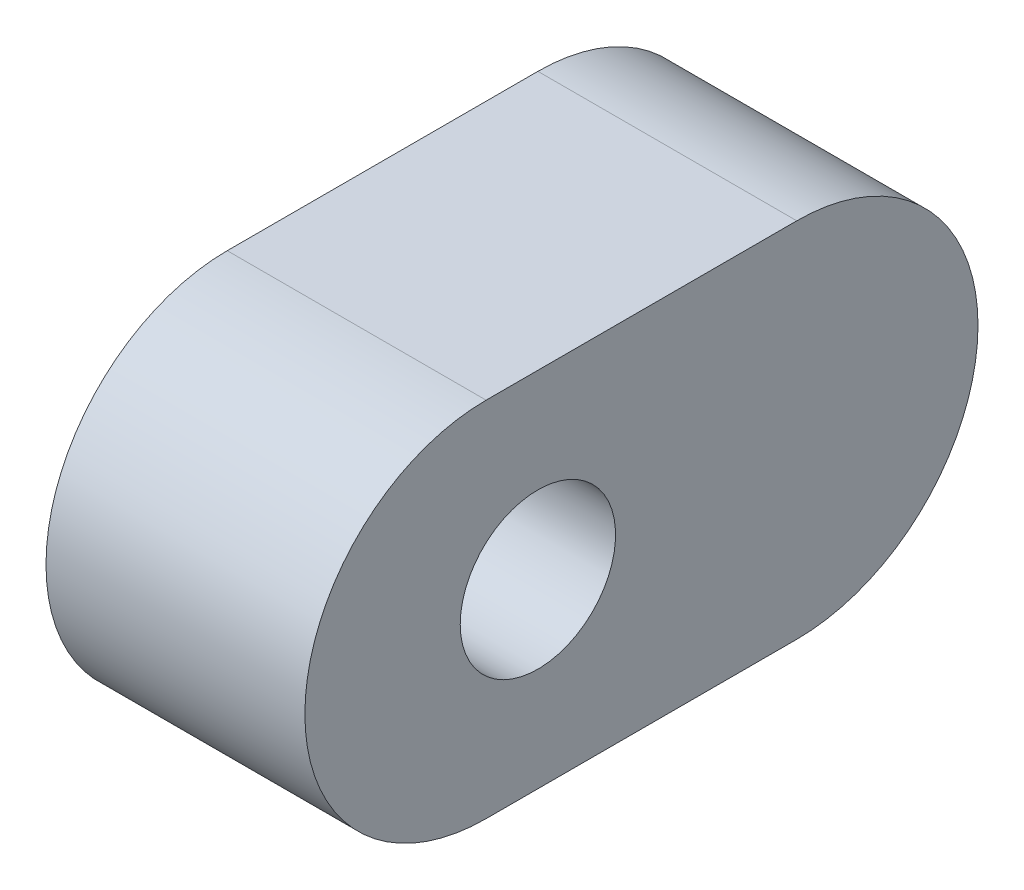
ISO-10303-21;
HEADER;
FILE_DESCRIPTION(('STEP AP214'),'2;1');
FILE_NAME('part.step','',(''),(''),'','','');
FILE_SCHEMA(('AUTOMOTIVE_DESIGN { 1 0 10303 214 1 1 1 1 }'));
ENDSEC;
DATA;
#1=APPLICATION_CONTEXT('core data for automotive mechanical design processes');
#2=APPLICATION_PROTOCOL_DEFINITION('international standard','automotive_design',2000,#1);
#3=PRODUCT_CONTEXT('',#1,'mechanical');
#4=PRODUCT('Part','Part','',(#3));
#5=PRODUCT_RELATED_PRODUCT_CATEGORY('part','',(#4));
#6=PRODUCT_DEFINITION_FORMATION('','',#4);
#7=PRODUCT_DEFINITION_CONTEXT('part definition',#1,'design');
#8=PRODUCT_DEFINITION('design','',#6,#7);
#9=PRODUCT_DEFINITION_SHAPE('','',#8);
#10=(LENGTH_UNIT() NAMED_UNIT(*) SI_UNIT(.MILLI.,.METRE.));
#11=(NAMED_UNIT(*) PLANE_ANGLE_UNIT() SI_UNIT($,.RADIAN.));
#12=(NAMED_UNIT(*) SI_UNIT($,.STERADIAN.) SOLID_ANGLE_UNIT());
#13=UNCERTAINTY_MEASURE_WITH_UNIT(LENGTH_MEASURE(1.E-05),#10,'distance_accuracy_value','');
#14=(GEOMETRIC_REPRESENTATION_CONTEXT(3) GLOBAL_UNCERTAINTY_ASSIGNED_CONTEXT((#13)) GLOBAL_UNIT_ASSIGNED_CONTEXT((#10,
#11,#12)) REPRESENTATION_CONTEXT('',''));
#15=CARTESIAN_POINT('',(0.,0.,0.));
#16=DIRECTION('',(0.,0.,1.));
#17=DIRECTION('',(1.,0.,0.));
#18=AXIS2_PLACEMENT_3D('',#15,#16,#17);
#19=CARTESIAN_POINT('',(6.35,0.,-1.27));
#20=DIRECTION('',(-1.,0.,0.));
#21=DIRECTION('',(0.,0.,1.));
#22=AXIS2_PLACEMENT_3D('',#19,#20,#21);
#23=CYLINDRICAL_SURFACE('',#22,1.905);
#24=CARTESIAN_POINT('',(6.35,0.,-1.27));
#25=DIRECTION('',(-1.,0.,0.));
#26=DIRECTION('',(0.,0.,1.));
#27=AXIS2_PLACEMENT_3D('',#24,#25,#26);
#28=CIRCLE('',#27,1.905);
#29=CARTESIAN_POINT('',(6.35,0.,0.635));
#30=VERTEX_POINT('',#29);
#31=EDGE_CURVE('E115',#30,#30,#28,.T.);
#32=ORIENTED_EDGE('',*,*,#31,.F.);
#33=EDGE_LOOP('',(#32));
#34=FACE_BOUND('',#33,.T.);
#35=CARTESIAN_POINT('',(2.54,0.,-1.27));
#36=DIRECTION('',(-1.,0.,0.));
#37=DIRECTION('',(0.,0.,1.));
#38=AXIS2_PLACEMENT_3D('',#35,#36,#37);
#39=CIRCLE('',#38,1.905);
#40=CARTESIAN_POINT('',(2.54,0.,0.635));
#41=VERTEX_POINT('',#40);
#42=EDGE_CURVE('E44',#41,#41,#39,.F.);
#43=ORIENTED_EDGE('',*,*,#42,.F.);
#44=EDGE_LOOP('',(#43));
#45=FACE_BOUND('',#44,.T.);
#46=ADVANCED_FACE('F41',(#34,#45),#23,.F.);
#47=CARTESIAN_POINT('',(6.35,0.,0.));
#48=DIRECTION('',(1.,0.,0.));
#49=DIRECTION('',(0.,0.,-1.));
#50=AXIS2_PLACEMENT_3D('',#47,#48,#49);
#51=PLANE('',#50);
#52=ORIENTED_EDGE('',*,*,#31,.T.);
#53=EDGE_LOOP('',(#52));
#54=FACE_BOUND('',#53,.T.);
#55=DIRECTION('',(0.,0.,1.));
#56=VECTOR('',#55,1.);
#57=CARTESIAN_POINT('',(6.35,4.445,0.));
#58=LINE('',#57,#56);
#59=CARTESIAN_POINT('',(6.35,4.445,-7.62));
#60=VERTEX_POINT('',#59);
#61=CARTESIAN_POINT('',(6.35,4.445,0.));
#62=VERTEX_POINT('',#61);
#63=EDGE_CURVE('E108',#60,#62,#58,.T.);
#64=ORIENTED_EDGE('',*,*,#63,.T.);
#65=CARTESIAN_POINT('',(6.35,0.,0.));
#66=DIRECTION('',(1.,0.,0.));
#67=DIRECTION('',(0.,0.,-1.));
#68=AXIS2_PLACEMENT_3D('',#65,#66,#67);
#69=CIRCLE('',#68,4.445);
#70=CARTESIAN_POINT('',(6.35,-4.445,0.));
#71=VERTEX_POINT('',#70);
#72=EDGE_CURVE('E111',#62,#71,#69,.T.);
#73=ORIENTED_EDGE('',*,*,#72,.T.);
#74=DIRECTION('',(0.,0.,-1.));
#75=VECTOR('',#74,1.);
#76=CARTESIAN_POINT('',(6.35,-4.445,0.));
#77=LINE('',#76,#75);
#78=CARTESIAN_POINT('',(6.35,-4.445,-7.62));
#79=VERTEX_POINT('',#78);
#80=EDGE_CURVE('E91',#71,#79,#77,.T.);
#81=ORIENTED_EDGE('',*,*,#80,.T.);
#82=CARTESIAN_POINT('',(6.35,0.,-7.62));
#83=DIRECTION('',(1.,0.,0.));
#84=DIRECTION('',(0.,0.,-1.));
#85=AXIS2_PLACEMENT_3D('',#82,#83,#84);
#86=CIRCLE('',#85,4.445);
#87=EDGE_CURVE('E101',#79,#60,#86,.T.);
#88=ORIENTED_EDGE('',*,*,#87,.T.);
#89=EDGE_LOOP('',(#64,#73,#81,#88));
#90=FACE_BOUND('',#89,.T.);
#91=ADVANCED_FACE('F118',(#54,#90),#51,.T.);
#92=CARTESIAN_POINT('',(0.,0.,0.));
#93=DIRECTION('',(1.,0.,0.));
#94=DIRECTION('',(0.,0.,-1.));
#95=AXIS2_PLACEMENT_3D('',#92,#93,#94);
#96=PLANE('',#95);
#97=CARTESIAN_POINT('',(0.,0.,-1.27));
#98=DIRECTION('',(-1.,0.,0.));
#99=DIRECTION('',(0.,0.,1.));
#100=AXIS2_PLACEMENT_3D('',#97,#98,#99);
#101=CIRCLE('',#100,3.048);
#102=CARTESIAN_POINT('',(0.,0.,1.778));
#103=VERTEX_POINT('',#102);
#104=EDGE_CURVE('E156',#103,#103,#101,.T.);
#105=ORIENTED_EDGE('',*,*,#104,.F.);
#106=EDGE_LOOP('',(#105));
#107=FACE_BOUND('',#106,.T.);
#108=DIRECTION('',(0.,0.,1.));
#109=VECTOR('',#108,1.);
#110=CARTESIAN_POINT('',(0.,4.445,0.));
#111=LINE('',#110,#109);
#112=CARTESIAN_POINT('',(0.,4.445,-7.62));
#113=VERTEX_POINT('',#112);
#114=CARTESIAN_POINT('',(0.,4.445,0.));
#115=VERTEX_POINT('',#114);
#116=EDGE_CURVE('E103',#113,#115,#111,.T.);
#117=ORIENTED_EDGE('',*,*,#116,.F.);
#118=CARTESIAN_POINT('',(0.,0.,-7.62));
#119=DIRECTION('',(1.,0.,0.));
#120=DIRECTION('',(0.,0.,-1.));
#121=AXIS2_PLACEMENT_3D('',#118,#119,#120);
#122=CIRCLE('',#121,4.445);
#123=CARTESIAN_POINT('',(0.,-4.445,-7.62));
#124=VERTEX_POINT('',#123);
#125=EDGE_CURVE('E96',#124,#113,#122,.T.);
#126=ORIENTED_EDGE('',*,*,#125,.F.);
#127=DIRECTION('',(0.,0.,-1.));
#128=VECTOR('',#127,1.);
#129=CARTESIAN_POINT('',(0.,-4.445,0.));
#130=LINE('',#129,#128);
#131=CARTESIAN_POINT('',(0.,-4.445,0.));
#132=VERTEX_POINT('',#131);
#133=EDGE_CURVE('E93',#132,#124,#130,.T.);
#134=ORIENTED_EDGE('',*,*,#133,.F.);
#135=CARTESIAN_POINT('',(0.,0.,0.));
#136=DIRECTION('',(1.,0.,0.));
#137=DIRECTION('',(0.,0.,-1.));
#138=AXIS2_PLACEMENT_3D('',#135,#136,#137);
#139=CIRCLE('',#138,4.445);
#140=EDGE_CURVE('E97',#115,#132,#139,.T.);
#141=ORIENTED_EDGE('',*,*,#140,.F.);
#142=EDGE_LOOP('',(#117,#126,#134,#141));
#143=FACE_BOUND('',#142,.T.);
#144=ADVANCED_FACE('F43',(#107,#143),#96,.F.);
#145=CARTESIAN_POINT('',(0.,4.445,0.));
#146=DIRECTION('',(0.,1.,0.));
#147=DIRECTION('',(0.,0.,1.));
#148=AXIS2_PLACEMENT_3D('',#145,#146,#147);
#149=PLANE('',#148);
#150=ORIENTED_EDGE('',*,*,#63,.F.);
#151=DIRECTION('',(1.,0.,0.));
#152=VECTOR('',#151,1.);
#153=CARTESIAN_POINT('',(0.,4.445,-7.62));
#154=LINE('',#153,#152);
#155=EDGE_CURVE('E11',#113,#60,#154,.T.);
#156=ORIENTED_EDGE('',*,*,#155,.F.);
#157=ORIENTED_EDGE('',*,*,#116,.T.);
#158=DIRECTION('',(1.,0.,0.));
#159=VECTOR('',#158,1.);
#160=CARTESIAN_POINT('',(0.,4.445,0.));
#161=LINE('',#160,#159);
#162=EDGE_CURVE('E83',#115,#62,#161,.T.);
#163=ORIENTED_EDGE('',*,*,#162,.T.);
#164=EDGE_LOOP('',(#150,#156,#157,#163));
#165=FACE_BOUND('',#164,.T.);
#166=ADVANCED_FACE('F120',(#165),#149,.T.);
#167=CARTESIAN_POINT('',(0.,0.,-7.62));
#168=DIRECTION('',(1.,0.,0.));
#169=DIRECTION('',(0.,0.,-1.));
#170=AXIS2_PLACEMENT_3D('',#167,#168,#169);
#171=CYLINDRICAL_SURFACE('',#170,4.445);
#172=ORIENTED_EDGE('',*,*,#87,.F.);
#173=DIRECTION('',(1.,0.,0.));
#174=VECTOR('',#173,1.);
#175=CARTESIAN_POINT('',(0.,-4.445,-7.62));
#176=LINE('',#175,#174);
#177=EDGE_CURVE('E51',#124,#79,#176,.T.);
#178=ORIENTED_EDGE('',*,*,#177,.F.);
#179=ORIENTED_EDGE('',*,*,#125,.T.);
#180=ORIENTED_EDGE('',*,*,#155,.T.);
#181=EDGE_LOOP('',(#172,#178,#179,#180));
#182=FACE_BOUND('',#181,.T.);
#183=ADVANCED_FACE('F119',(#182),#171,.T.);
#184=CARTESIAN_POINT('',(0.,-4.445,0.));
#185=DIRECTION('',(0.,-1.,0.));
#186=DIRECTION('',(0.,0.,-1.));
#187=AXIS2_PLACEMENT_3D('',#184,#185,#186);
#188=PLANE('',#187);
#189=ORIENTED_EDGE('',*,*,#80,.F.);
#190=DIRECTION('',(1.,0.,0.));
#191=VECTOR('',#190,1.);
#192=CARTESIAN_POINT('',(0.,-4.445,0.));
#193=LINE('',#192,#191);
#194=EDGE_CURVE('E87',#132,#71,#193,.T.);
#195=ORIENTED_EDGE('',*,*,#194,.F.);
#196=ORIENTED_EDGE('',*,*,#133,.T.);
#197=ORIENTED_EDGE('',*,*,#177,.T.);
#198=EDGE_LOOP('',(#189,#195,#196,#197));
#199=FACE_BOUND('',#198,.T.);
#200=ADVANCED_FACE('F86',(#199),#188,.T.);
#201=CARTESIAN_POINT('',(0.,0.,0.));
#202=DIRECTION('',(1.,0.,0.));
#203=DIRECTION('',(0.,0.,-1.));
#204=AXIS2_PLACEMENT_3D('',#201,#202,#203);
#205=CYLINDRICAL_SURFACE('',#204,4.445);
#206=ORIENTED_EDGE('',*,*,#72,.F.);
#207=ORIENTED_EDGE('',*,*,#162,.F.);
#208=ORIENTED_EDGE('',*,*,#140,.T.);
#209=ORIENTED_EDGE('',*,*,#194,.T.);
#210=EDGE_LOOP('',(#206,#207,#208,#209));
#211=FACE_BOUND('',#210,.T.);
#212=ADVANCED_FACE('F99',(#211),#205,.T.);
#213=CARTESIAN_POINT('',(2.54,0.,-1.27));
#214=DIRECTION('',(-1.,0.,0.));
#215=DIRECTION('',(0.,0.,1.));
#216=AXIS2_PLACEMENT_3D('',#213,#214,#215);
#217=PLANE('',#216);
#218=CARTESIAN_POINT('',(2.54,0.,-1.27));
#219=DIRECTION('',(-1.,0.,0.));
#220=DIRECTION('',(0.,0.,1.));
#221=AXIS2_PLACEMENT_3D('',#218,#219,#220);
#222=CIRCLE('',#221,3.048);
#223=CARTESIAN_POINT('',(2.54,0.,1.778));
#224=VERTEX_POINT('',#223);
#225=EDGE_CURVE('E155',#224,#224,#222,.T.);
#226=ORIENTED_EDGE('',*,*,#225,.T.);
#227=EDGE_LOOP('',(#226));
#228=FACE_BOUND('',#227,.T.);
#229=ORIENTED_EDGE('',*,*,#42,.T.);
#230=EDGE_LOOP('',(#229));
#231=FACE_BOUND('',#230,.T.);
#232=ADVANCED_FACE('F141',(#228,#231),#217,.T.);
#233=CARTESIAN_POINT('',(2.54,0.,-1.27));
#234=DIRECTION('',(-1.,0.,0.));
#235=DIRECTION('',(0.,0.,1.));
#236=AXIS2_PLACEMENT_3D('',#233,#234,#235);
#237=CYLINDRICAL_SURFACE('',#236,3.048);
#238=ORIENTED_EDGE('',*,*,#225,.F.);
#239=EDGE_LOOP('',(#238));
#240=FACE_BOUND('',#239,.T.);
#241=ORIENTED_EDGE('',*,*,#104,.T.);
#242=EDGE_LOOP('',(#241));
#243=FACE_BOUND('',#242,.T.);
#244=ADVANCED_FACE('F137',(#240,#243),#237,.F.);
#245=CLOSED_SHELL('',(#46,#91,#144,#166,#183,#200,#212,#232,#244));
#246=MANIFOLD_SOLID_BREP('B2',#245);
#247=ADVANCED_BREP_SHAPE_REPRESENTATION('',(#18,#246),#14);
#248=SHAPE_DEFINITION_REPRESENTATION(#9,#247);
ENDSEC;
END-ISO-10303-21;
